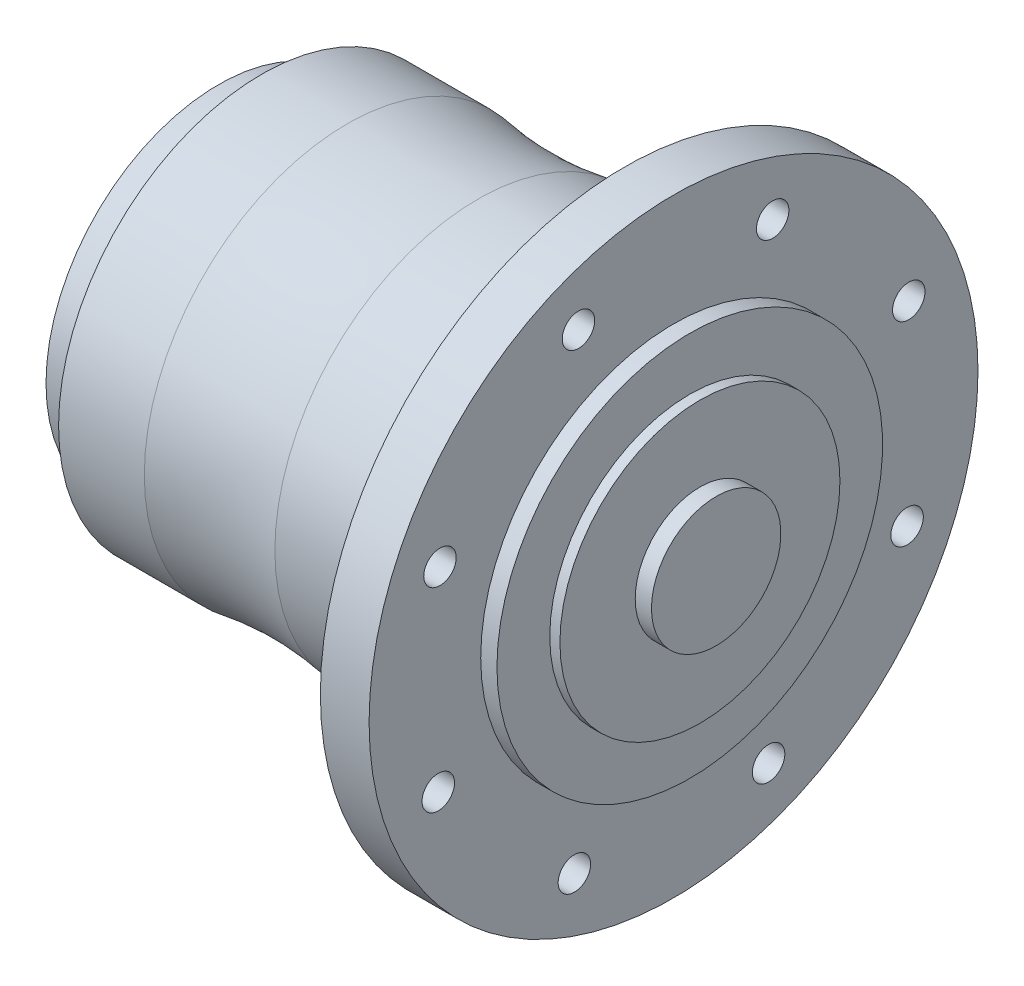
ISO-10303-21;
HEADER;
FILE_DESCRIPTION(('STEP AP214'),'2;1');
FILE_NAME('part.step','',(''),(''),'','','');
FILE_SCHEMA(('AUTOMOTIVE_DESIGN { 1 0 10303 214 1 1 1 1 }'));
ENDSEC;
DATA;
#1=APPLICATION_CONTEXT('core data for automotive mechanical design processes');
#2=APPLICATION_PROTOCOL_DEFINITION('international standard','automotive_design',2000,#1);
#3=PRODUCT_CONTEXT('',#1,'mechanical');
#4=PRODUCT('Part','Part','',(#3));
#5=PRODUCT_RELATED_PRODUCT_CATEGORY('part','',(#4));
#6=PRODUCT_DEFINITION_FORMATION('','',#4);
#7=PRODUCT_DEFINITION_CONTEXT('part definition',#1,'design');
#8=PRODUCT_DEFINITION('design','',#6,#7);
#9=PRODUCT_DEFINITION_SHAPE('','',#8);
#10=(LENGTH_UNIT() NAMED_UNIT(*) SI_UNIT(.MILLI.,.METRE.));
#11=(NAMED_UNIT(*) PLANE_ANGLE_UNIT() SI_UNIT($,.RADIAN.));
#12=(NAMED_UNIT(*) SI_UNIT($,.STERADIAN.) SOLID_ANGLE_UNIT());
#13=UNCERTAINTY_MEASURE_WITH_UNIT(LENGTH_MEASURE(1.E-05),#10,'distance_accuracy_value','');
#14=(GEOMETRIC_REPRESENTATION_CONTEXT(3) GLOBAL_UNCERTAINTY_ASSIGNED_CONTEXT((#13)) GLOBAL_UNIT_ASSIGNED_CONTEXT((#10,
#11,#12)) REPRESENTATION_CONTEXT('',''));
#15=CARTESIAN_POINT('',(0.,0.,0.));
#16=DIRECTION('',(0.,0.,1.));
#17=DIRECTION('',(1.,0.,0.));
#18=AXIS2_PLACEMENT_3D('',#15,#16,#17);
#19=CARTESIAN_POINT('',(260.5,31.8697858777785,0.));
#20=DIRECTION('',(-1.,0.,0.));
#21=DIRECTION('',(0.,0.,1.));
#22=AXIS2_PLACEMENT_3D('',#19,#20,#21);
#23=PLANE('',#22);
#24=CARTESIAN_POINT('',(260.5,0.,0.));
#25=DIRECTION('',(-1.,0.,0.));
#26=DIRECTION('',(0.,0.,1.));
#27=AXIS2_PLACEMENT_3D('',#24,#25,#26);
#28=CIRCLE('',#27,31.8697858777785);
#29=CARTESIAN_POINT('',(260.5,0.,31.8697858777785));
#30=VERTEX_POINT('',#29);
#31=EDGE_CURVE('E10',#30,#30,#28,.T.);
#32=ORIENTED_EDGE('',*,*,#31,.F.);
#33=EDGE_LOOP('',(#32));
#34=FACE_BOUND('',#33,.T.);
#35=ADVANCED_FACE('F33',(#34),#23,.F.);
#36=CARTESIAN_POINT('',(0.,0.,0.));
#37=DIRECTION('',(-1.,0.,0.));
#38=DIRECTION('',(0.,0.,1.));
#39=AXIS2_PLACEMENT_3D('',#36,#37,#38);
#40=CYLINDRICAL_SURFACE('',#39,31.8697858777785);
#41=CARTESIAN_POINT('',(252.5,0.,0.));
#42=DIRECTION('',(-1.,0.,0.));
#43=DIRECTION('',(0.,0.,1.));
#44=AXIS2_PLACEMENT_3D('',#41,#42,#43);
#45=CIRCLE('',#44,31.8697858777785);
#46=CARTESIAN_POINT('',(252.5,0.,31.8697858777785));
#47=VERTEX_POINT('',#46);
#48=EDGE_CURVE('E39',#47,#47,#45,.T.);
#49=ORIENTED_EDGE('',*,*,#48,.F.);
#50=EDGE_LOOP('',(#49));
#51=FACE_BOUND('',#50,.T.);
#52=ORIENTED_EDGE('',*,*,#31,.T.);
#53=EDGE_LOOP('',(#52));
#54=FACE_BOUND('',#53,.T.);
#55=ADVANCED_FACE('F202',(#51,#54),#40,.T.);
#56=CARTESIAN_POINT('',(252.5,68.9846696236896,0.));
#57=DIRECTION('',(-1.,0.,0.));
#58=DIRECTION('',(0.,0.,1.));
#59=AXIS2_PLACEMENT_3D('',#56,#57,#58);
#60=PLANE('',#59);
#61=CARTESIAN_POINT('',(252.5,0.,0.));
#62=DIRECTION('',(-1.,0.,0.));
#63=DIRECTION('',(0.,0.,1.));
#64=AXIS2_PLACEMENT_3D('',#61,#62,#63);
#65=CIRCLE('',#64,68.9846696236896);
#66=CARTESIAN_POINT('',(252.5,0.,68.9846696236896));
#67=VERTEX_POINT('',#66);
#68=EDGE_CURVE('E43',#67,#67,#65,.T.);
#69=ORIENTED_EDGE('',*,*,#68,.F.);
#70=EDGE_LOOP('',(#69));
#71=FACE_BOUND('',#70,.T.);
#72=ORIENTED_EDGE('',*,*,#48,.T.);
#73=EDGE_LOOP('',(#72));
#74=FACE_BOUND('',#73,.T.);
#75=ADVANCED_FACE('F197',(#71,#74),#60,.F.);
#76=CARTESIAN_POINT('',(0.,0.,0.));
#77=DIRECTION('',(-1.,0.,0.));
#78=DIRECTION('',(0.,0.,1.));
#79=AXIS2_PLACEMENT_3D('',#76,#77,#78);
#80=CYLINDRICAL_SURFACE('',#79,68.9846696236896);
#81=CARTESIAN_POINT('',(247.5,0.,0.));
#82=DIRECTION('',(-1.,0.,0.));
#83=DIRECTION('',(0.,0.,1.));
#84=AXIS2_PLACEMENT_3D('',#81,#82,#83);
#85=CIRCLE('',#84,68.9846696236896);
#86=CARTESIAN_POINT('',(247.5,0.,68.9846696236896));
#87=VERTEX_POINT('',#86);
#88=EDGE_CURVE('E47',#87,#87,#85,.T.);
#89=ORIENTED_EDGE('',*,*,#88,.F.);
#90=EDGE_LOOP('',(#89));
#91=FACE_BOUND('',#90,.T.);
#92=ORIENTED_EDGE('',*,*,#68,.T.);
#93=EDGE_LOOP('',(#92));
#94=FACE_BOUND('',#93,.T.);
#95=ADVANCED_FACE('F191',(#91,#94),#80,.T.);
#96=CARTESIAN_POINT('',(247.5,95.,0.));
#97=DIRECTION('',(-1.,0.,0.));
#98=DIRECTION('',(0.,0.,1.));
#99=AXIS2_PLACEMENT_3D('',#96,#97,#98);
#100=PLANE('',#99);
#101=CARTESIAN_POINT('',(247.5,0.,0.));
#102=DIRECTION('',(-1.,0.,0.));
#103=DIRECTION('',(0.,0.,1.));
#104=AXIS2_PLACEMENT_3D('',#101,#102,#103);
#105=CIRCLE('',#104,95.);
#106=CARTESIAN_POINT('',(247.5,0.,95.));
#107=VERTEX_POINT('',#106);
#108=EDGE_CURVE('E52',#107,#107,#105,.T.);
#109=ORIENTED_EDGE('',*,*,#108,.F.);
#110=EDGE_LOOP('',(#109));
#111=FACE_BOUND('',#110,.T.);
#112=ORIENTED_EDGE('',*,*,#88,.T.);
#113=EDGE_LOOP('',(#112));
#114=FACE_BOUND('',#113,.T.);
#115=ADVANCED_FACE('F185',(#111,#114),#100,.F.);
#116=CARTESIAN_POINT('',(0.,0.,0.));
#117=DIRECTION('',(-1.,0.,0.));
#118=DIRECTION('',(0.,0.,1.));
#119=AXIS2_PLACEMENT_3D('',#116,#117,#118);
#120=CYLINDRICAL_SURFACE('',#119,95.);
#121=CARTESIAN_POINT('',(239.5,0.,0.));
#122=DIRECTION('',(-1.,0.,0.));
#123=DIRECTION('',(0.,0.,1.));
#124=AXIS2_PLACEMENT_3D('',#121,#122,#123);
#125=CIRCLE('',#124,95.);
#126=CARTESIAN_POINT('',(239.5,0.,95.));
#127=VERTEX_POINT('',#126);
#128=EDGE_CURVE('E55',#127,#127,#125,.T.);
#129=ORIENTED_EDGE('',*,*,#128,.F.);
#130=EDGE_LOOP('',(#129));
#131=FACE_BOUND('',#130,.T.);
#132=ORIENTED_EDGE('',*,*,#108,.T.);
#133=EDGE_LOOP('',(#132));
#134=FACE_BOUND('',#133,.T.);
#135=ADVANCED_FACE('F178',(#131,#134),#120,.T.);
#136=CARTESIAN_POINT('',(239.5,150.,0.));
#137=DIRECTION('',(-1.,0.,0.));
#138=DIRECTION('',(0.,0.,1.));
#139=AXIS2_PLACEMENT_3D('',#136,#137,#138);
#140=PLANE('',#139);
#141=CARTESIAN_POINT('',(239.5,48.8413910611605,115.063106681554));
#142=DIRECTION('',(-1.,0.,0.));
#143=DIRECTION('',(0.,0.,1.));
#144=AXIS2_PLACEMENT_3D('',#141,#142,#143);
#145=CIRCLE('',#144,8.);
#146=CARTESIAN_POINT('',(239.5,48.8413910611605,123.063106681554));
#147=VERTEX_POINT('',#146);
#148=EDGE_CURVE('E136',#147,#147,#145,.F.);
#149=ORIENTED_EDGE('',*,*,#148,.F.);
#150=EDGE_LOOP('',(#149));
#151=FACE_BOUND('',#150,.T.);
#152=CARTESIAN_POINT('',(239.5,-46.8258241769879,115.897981820849));
#153=DIRECTION('',(-1.,0.,0.));
#154=DIRECTION('',(0.,0.,1.));
#155=AXIS2_PLACEMENT_3D('',#152,#153,#154);
#156=CIRCLE('',#155,8.);
#157=CARTESIAN_POINT('',(239.5,-46.8258241769879,123.897981820849));
#158=VERTEX_POINT('',#157);
#159=EDGE_CURVE('E130',#158,#158,#156,.F.);
#160=ORIENTED_EDGE('',*,*,#159,.F.);
#161=EDGE_LOOP('',(#160));
#162=FACE_BOUND('',#161,.T.);
#163=CARTESIAN_POINT('',(239.5,-115.063106681555,48.8413910611601));
#164=DIRECTION('',(-1.,0.,0.));
#165=DIRECTION('',(0.,0.,1.));
#166=AXIS2_PLACEMENT_3D('',#163,#164,#165);
#167=CIRCLE('',#166,8.);
#168=CARTESIAN_POINT('',(239.5,-115.063106681555,56.8413910611601));
#169=VERTEX_POINT('',#168);
#170=EDGE_CURVE('E124',#169,#169,#167,.F.);
#171=ORIENTED_EDGE('',*,*,#170,.F.);
#172=EDGE_LOOP('',(#171));
#173=FACE_BOUND('',#172,.T.);
#174=CARTESIAN_POINT('',(239.5,-115.897981820848,-46.8258241769891));
#175=DIRECTION('',(-1.,0.,0.));
#176=DIRECTION('',(0.,0.,1.));
#177=AXIS2_PLACEMENT_3D('',#174,#175,#176);
#178=CIRCLE('',#177,8.);
#179=CARTESIAN_POINT('',(239.5,-115.897981820848,-38.8258241769891));
#180=VERTEX_POINT('',#179);
#181=EDGE_CURVE('E118',#180,#180,#178,.F.);
#182=ORIENTED_EDGE('',*,*,#181,.F.);
#183=EDGE_LOOP('',(#182));
#184=FACE_BOUND('',#183,.T.);
#185=CARTESIAN_POINT('',(239.5,-48.8413910611597,-115.063106681555));
#186=DIRECTION('',(-1.,0.,0.));
#187=DIRECTION('',(0.,0.,1.));
#188=AXIS2_PLACEMENT_3D('',#185,#186,#187);
#189=CIRCLE('',#188,8.);
#190=CARTESIAN_POINT('',(239.5,-48.8413910611597,-107.063106681555));
#191=VERTEX_POINT('',#190);
#192=EDGE_CURVE('E112',#191,#191,#189,.F.);
#193=ORIENTED_EDGE('',*,*,#192,.F.);
#194=EDGE_LOOP('',(#193));
#195=FACE_BOUND('',#194,.T.);
#196=CARTESIAN_POINT('',(239.5,46.8258241769887,-115.897981820849));
#197=DIRECTION('',(-1.,0.,0.));
#198=DIRECTION('',(0.,0.,1.));
#199=AXIS2_PLACEMENT_3D('',#196,#197,#198);
#200=CIRCLE('',#199,8.);
#201=CARTESIAN_POINT('',(239.5,46.8258241769887,-107.897981820849));
#202=VERTEX_POINT('',#201);
#203=EDGE_CURVE('E106',#202,#202,#200,.F.);
#204=ORIENTED_EDGE('',*,*,#203,.F.);
#205=EDGE_LOOP('',(#204));
#206=FACE_BOUND('',#205,.T.);
#207=CARTESIAN_POINT('',(239.5,115.063106681555,-48.8413910611593));
#208=DIRECTION('',(-1.,0.,0.));
#209=DIRECTION('',(0.,0.,1.));
#210=AXIS2_PLACEMENT_3D('',#207,#208,#209);
#211=CIRCLE('',#210,8.);
#212=CARTESIAN_POINT('',(239.5,115.063106681555,-40.8413910611593));
#213=VERTEX_POINT('',#212);
#214=EDGE_CURVE('E100',#213,#213,#211,.F.);
#215=ORIENTED_EDGE('',*,*,#214,.F.);
#216=EDGE_LOOP('',(#215));
#217=FACE_BOUND('',#216,.T.);
#218=CARTESIAN_POINT('',(239.5,115.897981820848,46.8258241769891));
#219=DIRECTION('',(-1.,0.,0.));
#220=DIRECTION('',(0.,0.,1.));
#221=AXIS2_PLACEMENT_3D('',#218,#219,#220);
#222=CIRCLE('',#221,8.);
#223=CARTESIAN_POINT('',(239.5,115.897981820848,54.8258241769891));
#224=VERTEX_POINT('',#223);
#225=EDGE_CURVE('E94',#224,#224,#222,.F.);
#226=ORIENTED_EDGE('',*,*,#225,.F.);
#227=EDGE_LOOP('',(#226));
#228=FACE_BOUND('',#227,.T.);
#229=CARTESIAN_POINT('',(239.5,0.,0.));
#230=DIRECTION('',(-1.,0.,0.));
#231=DIRECTION('',(0.,0.,1.));
#232=AXIS2_PLACEMENT_3D('',#229,#230,#231);
#233=CIRCLE('',#232,150.);
#234=CARTESIAN_POINT('',(239.5,0.,150.));
#235=VERTEX_POINT('',#234);
#236=EDGE_CURVE('E58',#235,#235,#233,.T.);
#237=ORIENTED_EDGE('',*,*,#236,.F.);
#238=EDGE_LOOP('',(#237));
#239=FACE_BOUND('',#238,.T.);
#240=ORIENTED_EDGE('',*,*,#128,.T.);
#241=EDGE_LOOP('',(#240));
#242=FACE_BOUND('',#241,.T.);
#243=ADVANCED_FACE('F172',(#151,#162,#173,#184,#195,#206,#217,#228,#239,#242),#140,.F.);
#244=CARTESIAN_POINT('',(0.,0.,0.));
#245=DIRECTION('',(-1.,0.,0.));
#246=DIRECTION('',(0.,0.,1.));
#247=AXIS2_PLACEMENT_3D('',#244,#245,#246);
#248=CYLINDRICAL_SURFACE('',#247,150.);
#249=CARTESIAN_POINT('',(215.5,0.,0.));
#250=DIRECTION('',(-1.,0.,0.));
#251=DIRECTION('',(0.,0.,1.));
#252=AXIS2_PLACEMENT_3D('',#249,#250,#251);
#253=CIRCLE('',#252,150.);
#254=CARTESIAN_POINT('',(215.5,0.,150.));
#255=VERTEX_POINT('',#254);
#256=EDGE_CURVE('E61',#255,#255,#253,.T.);
#257=ORIENTED_EDGE('',*,*,#256,.F.);
#258=EDGE_LOOP('',(#257));
#259=FACE_BOUND('',#258,.T.);
#260=ORIENTED_EDGE('',*,*,#236,.T.);
#261=EDGE_LOOP('',(#260));
#262=FACE_BOUND('',#261,.T.);
#263=ADVANCED_FACE('F150',(#259,#262),#248,.T.);
#264=CARTESIAN_POINT('',(215.5,100.,0.));
#265=DIRECTION('',(1.,0.,0.));
#266=DIRECTION('',(0.,0.,-1.));
#267=AXIS2_PLACEMENT_3D('',#264,#265,#266);
#268=PLANE('',#267);
#269=CARTESIAN_POINT('',(215.5,48.8413910611605,115.063106681554));
#270=DIRECTION('',(-1.,0.,0.));
#271=DIRECTION('',(0.,-0.707106781186539,0.707106781186556));
#272=AXIS2_PLACEMENT_3D('',#269,#270,#271);
#273=CIRCLE('',#272,8.);
#274=CARTESIAN_POINT('',(215.5,43.1845368116682,120.719960931047));
#275=VERTEX_POINT('',#274);
#276=EDGE_CURVE('E139',#275,#275,#273,.T.);
#277=ORIENTED_EDGE('',*,*,#276,.F.);
#278=EDGE_LOOP('',(#277));
#279=FACE_BOUND('',#278,.T.);
#280=CARTESIAN_POINT('',(215.5,-46.8258241769879,115.897981820849));
#281=DIRECTION('',(-1.,0.,0.));
#282=DIRECTION('',(0.,-1.,0.));
#283=AXIS2_PLACEMENT_3D('',#280,#281,#282);
#284=CIRCLE('',#283,8.);
#285=CARTESIAN_POINT('',(215.5,-54.8258241769879,115.897981820849));
#286=VERTEX_POINT('',#285);
#287=EDGE_CURVE('E133',#286,#286,#284,.T.);
#288=ORIENTED_EDGE('',*,*,#287,.F.);
#289=EDGE_LOOP('',(#288));
#290=FACE_BOUND('',#289,.T.);
#291=CARTESIAN_POINT('',(215.5,-115.063106681555,48.8413910611601));
#292=DIRECTION('',(-1.,0.,0.));
#293=DIRECTION('',(0.,-0.707106781186554,-0.707106781186541));
#294=AXIS2_PLACEMENT_3D('',#291,#292,#293);
#295=CIRCLE('',#294,8.);
#296=CARTESIAN_POINT('',(215.5,-120.719960931047,43.1845368116678));
#297=VERTEX_POINT('',#296);
#298=EDGE_CURVE('E127',#297,#297,#295,.T.);
#299=ORIENTED_EDGE('',*,*,#298,.F.);
#300=EDGE_LOOP('',(#299));
#301=FACE_BOUND('',#300,.T.);
#302=CARTESIAN_POINT('',(215.5,-115.897981820848,-46.8258241769891));
#303=DIRECTION('',(-1.,0.,0.));
#304=DIRECTION('',(0.,0.,-1.));
#305=AXIS2_PLACEMENT_3D('',#302,#303,#304);
#306=CIRCLE('',#305,8.);
#307=CARTESIAN_POINT('',(215.5,-115.897981820848,-54.8258241769891));
#308=VERTEX_POINT('',#307);
#309=EDGE_CURVE('E121',#308,#308,#306,.T.);
#310=ORIENTED_EDGE('',*,*,#309,.F.);
#311=EDGE_LOOP('',(#310));
#312=FACE_BOUND('',#311,.T.);
#313=CARTESIAN_POINT('',(215.5,-48.8413910611597,-115.063106681555));
#314=DIRECTION('',(-1.,0.,0.));
#315=DIRECTION('',(0.,0.707106781186544,-0.707106781186551));
#316=AXIS2_PLACEMENT_3D('',#313,#314,#315);
#317=CIRCLE('',#316,8.);
#318=CARTESIAN_POINT('',(215.5,-43.1845368116674,-120.719960931047));
#319=VERTEX_POINT('',#318);
#320=EDGE_CURVE('E115',#319,#319,#317,.T.);
#321=ORIENTED_EDGE('',*,*,#320,.F.);
#322=EDGE_LOOP('',(#321));
#323=FACE_BOUND('',#322,.T.);
#324=CARTESIAN_POINT('',(215.5,46.8258241769887,-115.897981820849));
#325=DIRECTION('',(-1.,0.,0.));
#326=DIRECTION('',(0.,1.,0.));
#327=AXIS2_PLACEMENT_3D('',#324,#325,#326);
#328=CIRCLE('',#327,8.);
#329=CARTESIAN_POINT('',(215.5,54.8258241769887,-115.897981820849));
#330=VERTEX_POINT('',#329);
#331=EDGE_CURVE('E109',#330,#330,#328,.T.);
#332=ORIENTED_EDGE('',*,*,#331,.F.);
#333=EDGE_LOOP('',(#332));
#334=FACE_BOUND('',#333,.T.);
#335=CARTESIAN_POINT('',(215.5,115.063106681555,-48.8413910611593));
#336=DIRECTION('',(-1.,0.,0.));
#337=DIRECTION('',(0.,0.707106781186549,0.707106781186546));
#338=AXIS2_PLACEMENT_3D('',#335,#336,#337);
#339=CIRCLE('',#338,8.);
#340=CARTESIAN_POINT('',(215.5,120.719960931047,-43.184536811667));
#341=VERTEX_POINT('',#340);
#342=EDGE_CURVE('E103',#341,#341,#339,.T.);
#343=ORIENTED_EDGE('',*,*,#342,.F.);
#344=EDGE_LOOP('',(#343));
#345=FACE_BOUND('',#344,.T.);
#346=CARTESIAN_POINT('',(215.5,115.897981820848,46.8258241769891));
#347=DIRECTION('',(-1.,0.,0.));
#348=DIRECTION('',(0.,0.,1.));
#349=AXIS2_PLACEMENT_3D('',#346,#347,#348);
#350=CIRCLE('',#349,8.);
#351=CARTESIAN_POINT('',(215.5,115.897981820848,54.8258241769891));
#352=VERTEX_POINT('',#351);
#353=EDGE_CURVE('E97',#352,#352,#350,.T.);
#354=ORIENTED_EDGE('',*,*,#353,.F.);
#355=EDGE_LOOP('',(#354));
#356=FACE_BOUND('',#355,.T.);
#357=CARTESIAN_POINT('',(215.5,0.,0.));
#358=DIRECTION('',(-1.,0.,0.));
#359=DIRECTION('',(0.,0.,1.));
#360=AXIS2_PLACEMENT_3D('',#357,#358,#359);
#361=CIRCLE('',#360,100.);
#362=CARTESIAN_POINT('',(215.5,0.,100.));
#363=VERTEX_POINT('',#362);
#364=EDGE_CURVE('E64',#363,#363,#361,.T.);
#365=ORIENTED_EDGE('',*,*,#364,.F.);
#366=EDGE_LOOP('',(#365));
#367=FACE_BOUND('',#366,.T.);
#368=ORIENTED_EDGE('',*,*,#256,.T.);
#369=EDGE_LOOP('',(#368));
#370=FACE_BOUND('',#369,.T.);
#371=ADVANCED_FACE('F146',(#279,#290,#301,#312,#323,#334,#345,#356,#367,#370),#268,.F.);
#372=CARTESIAN_POINT('',(0.,0.,0.));
#373=DIRECTION('',(-1.,0.,0.));
#374=DIRECTION('',(0.,0.,1.));
#375=AXIS2_PLACEMENT_3D('',#372,#373,#374);
#376=CYLINDRICAL_SURFACE('',#375,100.);
#377=CARTESIAN_POINT('',(143.083293935751,0.,0.));
#378=DIRECTION('',(-1.,0.,0.));
#379=DIRECTION('',(0.,0.,1.));
#380=AXIS2_PLACEMENT_3D('',#377,#378,#379);
#381=CIRCLE('',#380,100.);
#382=CARTESIAN_POINT('',(143.083293935751,0.,100.));
#383=VERTEX_POINT('',#382);
#384=EDGE_CURVE('E67',#383,#383,#381,.T.);
#385=ORIENTED_EDGE('',*,*,#384,.F.);
#386=EDGE_LOOP('',(#385));
#387=FACE_BOUND('',#386,.T.);
#388=ORIENTED_EDGE('',*,*,#364,.T.);
#389=EDGE_LOOP('',(#388));
#390=FACE_BOUND('',#389,.T.);
#391=ADVANCED_FACE('F149',(#387,#390),#376,.T.);
#392=CARTESIAN_POINT('',(110.917946702002,0.,0.));
#393=DIRECTION('',(-1.,0.,0.));
#394=DIRECTION('',(0.,0.,1.));
#395=AXIS2_PLACEMENT_3D('',#392,#393,#394);
#396=TOROIDAL_SURFACE('',#395,296.242255534234,198.860836817688);
#397=CARTESIAN_POINT('',(78.7525994682527,0.,0.));
#398=DIRECTION('',(-1.,0.,0.));
#399=DIRECTION('',(0.,0.,1.));
#400=AXIS2_PLACEMENT_3D('',#397,#398,#399);
#401=CIRCLE('',#400,100.);
#402=CARTESIAN_POINT('',(78.7525994682527,0.,100.));
#403=VERTEX_POINT('',#402);
#404=EDGE_CURVE('E70',#403,#403,#401,.T.);
#405=ORIENTED_EDGE('',*,*,#404,.F.);
#406=EDGE_LOOP('',(#405));
#407=FACE_BOUND('',#406,.T.);
#408=ORIENTED_EDGE('',*,*,#384,.T.);
#409=EDGE_LOOP('',(#408));
#410=FACE_BOUND('',#409,.T.);
#411=ADVANCED_FACE('F255',(#407,#410),#396,.F.);
#412=CARTESIAN_POINT('',(0.,0.,0.));
#413=DIRECTION('',(-1.,0.,0.));
#414=DIRECTION('',(0.,0.,1.));
#415=AXIS2_PLACEMENT_3D('',#412,#413,#414);
#416=CYLINDRICAL_SURFACE('',#415,100.);
#417=CARTESIAN_POINT('',(36.525030293611,0.,0.));
#418=DIRECTION('',(-1.,0.,0.));
#419=DIRECTION('',(0.,0.,1.));
#420=AXIS2_PLACEMENT_3D('',#417,#418,#419);
#421=CIRCLE('',#420,100.);
#422=CARTESIAN_POINT('',(36.525030293611,0.,100.));
#423=VERTEX_POINT('',#422);
#424=EDGE_CURVE('E73',#423,#423,#421,.T.);
#425=ORIENTED_EDGE('',*,*,#424,.F.);
#426=EDGE_LOOP('',(#425));
#427=FACE_BOUND('',#426,.T.);
#428=ORIENTED_EDGE('',*,*,#404,.T.);
#429=EDGE_LOOP('',(#428));
#430=FACE_BOUND('',#429,.T.);
#431=ADVANCED_FACE('F265',(#427,#430),#416,.T.);
#432=CARTESIAN_POINT('',(36.525030293611,85.,0.));
#433=DIRECTION('',(1.,0.,0.));
#434=DIRECTION('',(0.,0.,-1.));
#435=AXIS2_PLACEMENT_3D('',#432,#433,#434);
#436=PLANE('',#435);
#437=CARTESIAN_POINT('',(36.525030293611,0.,0.));
#438=DIRECTION('',(-1.,0.,0.));
#439=DIRECTION('',(0.,0.,1.));
#440=AXIS2_PLACEMENT_3D('',#437,#438,#439);
#441=CIRCLE('',#440,85.);
#442=CARTESIAN_POINT('',(36.525030293611,0.,85.));
#443=VERTEX_POINT('',#442);
#444=EDGE_CURVE('E76',#443,#443,#441,.T.);
#445=ORIENTED_EDGE('',*,*,#444,.F.);
#446=EDGE_LOOP('',(#445));
#447=FACE_BOUND('',#446,.T.);
#448=ORIENTED_EDGE('',*,*,#424,.T.);
#449=EDGE_LOOP('',(#448));
#450=FACE_BOUND('',#449,.T.);
#451=ADVANCED_FACE('F275',(#447,#450),#436,.F.);
#452=CARTESIAN_POINT('',(0.,0.,0.));
#453=DIRECTION('',(-1.,0.,0.));
#454=DIRECTION('',(0.,0.,1.));
#455=AXIS2_PLACEMENT_3D('',#452,#453,#454);
#456=CYLINDRICAL_SURFACE('',#455,85.);
#457=CARTESIAN_POINT('',(15.3341831465205,0.,0.));
#458=DIRECTION('',(-1.,0.,0.));
#459=DIRECTION('',(0.,0.,1.));
#460=AXIS2_PLACEMENT_3D('',#457,#458,#459);
#461=CIRCLE('',#460,85.);
#462=CARTESIAN_POINT('',(15.3341831465205,0.,85.));
#463=VERTEX_POINT('',#462);
#464=EDGE_CURVE('E79',#463,#463,#461,.T.);
#465=ORIENTED_EDGE('',*,*,#464,.F.);
#466=EDGE_LOOP('',(#465));
#467=FACE_BOUND('',#466,.T.);
#468=ORIENTED_EDGE('',*,*,#444,.T.);
#469=EDGE_LOOP('',(#468));
#470=FACE_BOUND('',#469,.T.);
#471=ADVANCED_FACE('F285',(#467,#470),#456,.T.);
#472=CARTESIAN_POINT('',(15.3341831465205,55.,0.));
#473=DIRECTION('',(1.,0.,0.));
#474=DIRECTION('',(0.,0.,-1.));
#475=AXIS2_PLACEMENT_3D('',#472,#473,#474);
#476=PLANE('',#475);
#477=CARTESIAN_POINT('',(15.3341831465205,0.,0.));
#478=DIRECTION('',(-1.,0.,0.));
#479=DIRECTION('',(0.,0.,1.));
#480=AXIS2_PLACEMENT_3D('',#477,#478,#479);
#481=CIRCLE('',#480,55.);
#482=CARTESIAN_POINT('',(15.3341831465205,0.,55.));
#483=VERTEX_POINT('',#482);
#484=EDGE_CURVE('E82',#483,#483,#481,.T.);
#485=ORIENTED_EDGE('',*,*,#484,.F.);
#486=EDGE_LOOP('',(#485));
#487=FACE_BOUND('',#486,.T.);
#488=ORIENTED_EDGE('',*,*,#464,.T.);
#489=EDGE_LOOP('',(#488));
#490=FACE_BOUND('',#489,.T.);
#491=ADVANCED_FACE('F295',(#487,#490),#476,.F.);
#492=CARTESIAN_POINT('',(0.,0.,0.));
#493=DIRECTION('',(-1.,0.,0.));
#494=DIRECTION('',(0.,0.,1.));
#495=AXIS2_PLACEMENT_3D('',#492,#493,#494);
#496=CYLINDRICAL_SURFACE('',#495,55.);
#497=CARTESIAN_POINT('',(8.00000000000001,0.,0.));
#498=DIRECTION('',(-1.,0.,0.));
#499=DIRECTION('',(0.,0.,1.));
#500=AXIS2_PLACEMENT_3D('',#497,#498,#499);
#501=CIRCLE('',#500,55.);
#502=CARTESIAN_POINT('',(8.00000000000001,0.,55.));
#503=VERTEX_POINT('',#502);
#504=EDGE_CURVE('E85',#503,#503,#501,.T.);
#505=ORIENTED_EDGE('',*,*,#504,.F.);
#506=EDGE_LOOP('',(#505));
#507=FACE_BOUND('',#506,.T.);
#508=ORIENTED_EDGE('',*,*,#484,.T.);
#509=EDGE_LOOP('',(#508));
#510=FACE_BOUND('',#509,.T.);
#511=ADVANCED_FACE('F305',(#507,#510),#496,.T.);
#512=CARTESIAN_POINT('',(8.00000000000001,40.,0.));
#513=DIRECTION('',(1.,0.,0.));
#514=DIRECTION('',(0.,0.,-1.));
#515=AXIS2_PLACEMENT_3D('',#512,#513,#514);
#516=PLANE('',#515);
#517=CARTESIAN_POINT('',(8.00000000000002,0.,0.));
#518=DIRECTION('',(-1.,0.,0.));
#519=DIRECTION('',(0.,0.,1.));
#520=AXIS2_PLACEMENT_3D('',#517,#518,#519);
#521=CIRCLE('',#520,40.);
#522=CARTESIAN_POINT('',(8.00000000000002,0.,40.));
#523=VERTEX_POINT('',#522);
#524=EDGE_CURVE('E88',#523,#523,#521,.T.);
#525=ORIENTED_EDGE('',*,*,#524,.F.);
#526=EDGE_LOOP('',(#525));
#527=FACE_BOUND('',#526,.T.);
#528=ORIENTED_EDGE('',*,*,#504,.T.);
#529=EDGE_LOOP('',(#528));
#530=FACE_BOUND('',#529,.T.);
#531=ADVANCED_FACE('F315',(#527,#530),#516,.F.);
#532=CARTESIAN_POINT('',(0.,0.,0.));
#533=DIRECTION('',(-1.,0.,0.));
#534=DIRECTION('',(0.,0.,1.));
#535=AXIS2_PLACEMENT_3D('',#532,#533,#534);
#536=CYLINDRICAL_SURFACE('',#535,40.);
#537=CARTESIAN_POINT('',(0.,0.,0.));
#538=DIRECTION('',(-1.,0.,0.));
#539=DIRECTION('',(0.,0.,1.));
#540=AXIS2_PLACEMENT_3D('',#537,#538,#539);
#541=CIRCLE('',#540,40.);
#542=CARTESIAN_POINT('',(0.,0.,40.));
#543=VERTEX_POINT('',#542);
#544=EDGE_CURVE('E91',#543,#543,#541,.T.);
#545=ORIENTED_EDGE('',*,*,#544,.F.);
#546=EDGE_LOOP('',(#545));
#547=FACE_BOUND('',#546,.T.);
#548=ORIENTED_EDGE('',*,*,#524,.T.);
#549=EDGE_LOOP('',(#548));
#550=FACE_BOUND('',#549,.T.);
#551=ADVANCED_FACE('F325',(#547,#550),#536,.T.);
#552=CARTESIAN_POINT('',(0.,0.,0.));
#553=DIRECTION('',(1.,0.,0.));
#554=DIRECTION('',(0.,0.,-1.));
#555=AXIS2_PLACEMENT_3D('',#552,#553,#554);
#556=PLANE('',#555);
#557=ORIENTED_EDGE('',*,*,#544,.T.);
#558=EDGE_LOOP('',(#557));
#559=FACE_BOUND('',#558,.T.);
#560=ADVANCED_FACE('F335',(#559),#556,.F.);
#561=CARTESIAN_POINT('',(260.501,115.897981820848,46.8258241769891));
#562=DIRECTION('',(-1.,0.,0.));
#563=DIRECTION('',(0.,0.,1.));
#564=AXIS2_PLACEMENT_3D('',#561,#562,#563);
#565=CYLINDRICAL_SURFACE('',#564,8.);
#566=ORIENTED_EDGE('',*,*,#353,.T.);
#567=EDGE_LOOP('',(#566));
#568=FACE_BOUND('',#567,.T.);
#569=ORIENTED_EDGE('',*,*,#225,.T.);
#570=EDGE_LOOP('',(#569));
#571=FACE_BOUND('',#570,.T.);
#572=ADVANCED_FACE('F345',(#568,#571),#565,.F.);
#573=CARTESIAN_POINT('',(260.501,115.063106681555,-48.8413910611593));
#574=DIRECTION('',(-1.,0.,0.));
#575=DIRECTION('',(0.,0.,1.));
#576=AXIS2_PLACEMENT_3D('',#573,#574,#575);
#577=CYLINDRICAL_SURFACE('',#576,8.);
#578=ORIENTED_EDGE('',*,*,#342,.T.);
#579=EDGE_LOOP('',(#578));
#580=FACE_BOUND('',#579,.T.);
#581=ORIENTED_EDGE('',*,*,#214,.T.);
#582=EDGE_LOOP('',(#581));
#583=FACE_BOUND('',#582,.T.);
#584=ADVANCED_FACE('F355',(#580,#583),#577,.F.);
#585=CARTESIAN_POINT('',(260.501,46.8258241769887,-115.897981820849));
#586=DIRECTION('',(-1.,0.,0.));
#587=DIRECTION('',(0.,0.,1.));
#588=AXIS2_PLACEMENT_3D('',#585,#586,#587);
#589=CYLINDRICAL_SURFACE('',#588,8.);
#590=ORIENTED_EDGE('',*,*,#331,.T.);
#591=EDGE_LOOP('',(#590));
#592=FACE_BOUND('',#591,.T.);
#593=ORIENTED_EDGE('',*,*,#203,.T.);
#594=EDGE_LOOP('',(#593));
#595=FACE_BOUND('',#594,.T.);
#596=ADVANCED_FACE('F375',(#592,#595),#589,.F.);
#597=CARTESIAN_POINT('',(260.501,-48.8413910611597,-115.063106681555));
#598=DIRECTION('',(-1.,0.,0.));
#599=DIRECTION('',(0.,0.,1.));
#600=AXIS2_PLACEMENT_3D('',#597,#598,#599);
#601=CYLINDRICAL_SURFACE('',#600,8.);
#602=ORIENTED_EDGE('',*,*,#320,.T.);
#603=EDGE_LOOP('',(#602));
#604=FACE_BOUND('',#603,.T.);
#605=ORIENTED_EDGE('',*,*,#192,.T.);
#606=EDGE_LOOP('',(#605));
#607=FACE_BOUND('',#606,.T.);
#608=ADVANCED_FACE('F385',(#604,#607),#601,.F.);
#609=CARTESIAN_POINT('',(260.501,-115.897981820848,-46.8258241769891));
#610=DIRECTION('',(-1.,0.,0.));
#611=DIRECTION('',(0.,0.,1.));
#612=AXIS2_PLACEMENT_3D('',#609,#610,#611);
#613=CYLINDRICAL_SURFACE('',#612,8.);
#614=ORIENTED_EDGE('',*,*,#309,.T.);
#615=EDGE_LOOP('',(#614));
#616=FACE_BOUND('',#615,.T.);
#617=ORIENTED_EDGE('',*,*,#181,.T.);
#618=EDGE_LOOP('',(#617));
#619=FACE_BOUND('',#618,.T.);
#620=ADVANCED_FACE('F395',(#616,#619),#613,.F.);
#621=CARTESIAN_POINT('',(260.501,-115.063106681555,48.8413910611601));
#622=DIRECTION('',(-1.,0.,0.));
#623=DIRECTION('',(0.,0.,1.));
#624=AXIS2_PLACEMENT_3D('',#621,#622,#623);
#625=CYLINDRICAL_SURFACE('',#624,8.);
#626=ORIENTED_EDGE('',*,*,#298,.T.);
#627=EDGE_LOOP('',(#626));
#628=FACE_BOUND('',#627,.T.);
#629=ORIENTED_EDGE('',*,*,#170,.T.);
#630=EDGE_LOOP('',(#629));
#631=FACE_BOUND('',#630,.T.);
#632=ADVANCED_FACE('F405',(#628,#631),#625,.F.);
#633=CARTESIAN_POINT('',(260.501,-46.8258241769879,115.897981820849));
#634=DIRECTION('',(-1.,0.,0.));
#635=DIRECTION('',(0.,0.,1.));
#636=AXIS2_PLACEMENT_3D('',#633,#634,#635);
#637=CYLINDRICAL_SURFACE('',#636,8.);
#638=ORIENTED_EDGE('',*,*,#287,.T.);
#639=EDGE_LOOP('',(#638));
#640=FACE_BOUND('',#639,.T.);
#641=ORIENTED_EDGE('',*,*,#159,.T.);
#642=EDGE_LOOP('',(#641));
#643=FACE_BOUND('',#642,.T.);
#644=ADVANCED_FACE('F415',(#640,#643),#637,.F.);
#645=CARTESIAN_POINT('',(260.501,48.8413910611605,115.063106681554));
#646=DIRECTION('',(-1.,0.,0.));
#647=DIRECTION('',(0.,0.,1.));
#648=AXIS2_PLACEMENT_3D('',#645,#646,#647);
#649=CYLINDRICAL_SURFACE('',#648,8.);
#650=ORIENTED_EDGE('',*,*,#276,.T.);
#651=EDGE_LOOP('',(#650));
#652=FACE_BOUND('',#651,.T.);
#653=ORIENTED_EDGE('',*,*,#148,.T.);
#654=EDGE_LOOP('',(#653));
#655=FACE_BOUND('',#654,.T.);
#656=ADVANCED_FACE('F143',(#652,#655),#649,.F.);
#657=CLOSED_SHELL('',(#35,#55,#75,#95,#115,#135,#243,#263,#371,#391,#411,#431,#451,#471,#491,
#511,#531,#551,#560,#572,#584,#596,#608,#620,#632,#644,#656));
#658=MANIFOLD_SOLID_BREP('B2',#657);
#659=ADVANCED_BREP_SHAPE_REPRESENTATION('',(#18,#658),#14);
#660=SHAPE_DEFINITION_REPRESENTATION(#9,#659);
ENDSEC;
END-ISO-10303-21;
